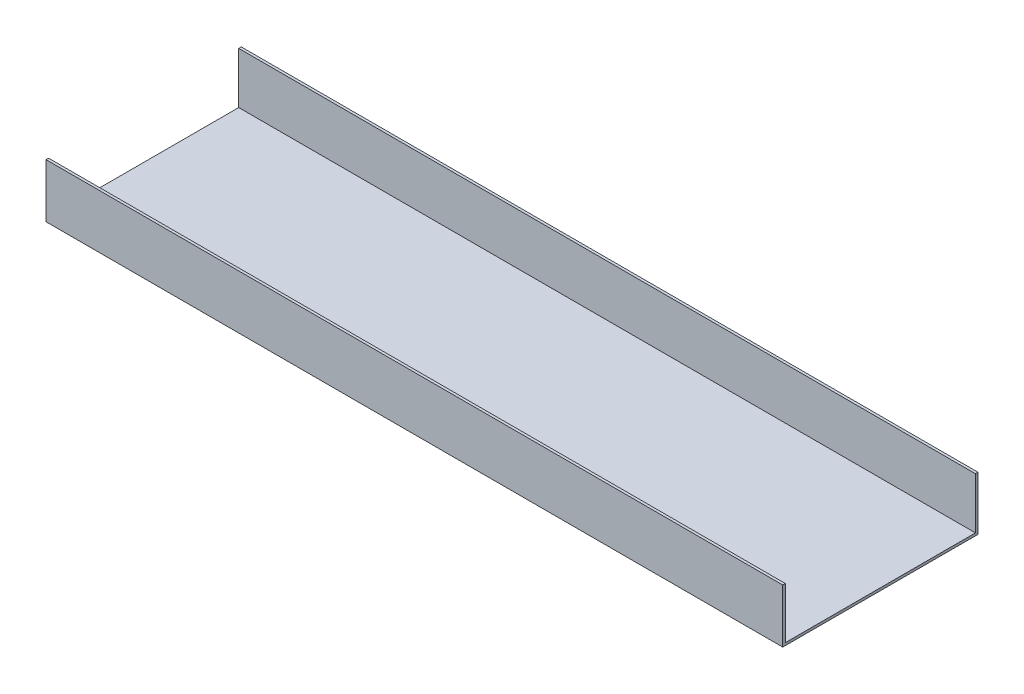
ISO-10303-21;
HEADER;
FILE_DESCRIPTION(('STEP AP214'),'2;1');
FILE_NAME('part.step','',(''),(''),'','','');
FILE_SCHEMA(('AUTOMOTIVE_DESIGN { 1 0 10303 214 1 1 1 1 }'));
ENDSEC;
DATA;
#1=APPLICATION_CONTEXT('core data for automotive mechanical design processes');
#2=APPLICATION_PROTOCOL_DEFINITION('international standard','automotive_design',2000,#1);
#3=PRODUCT_CONTEXT('',#1,'mechanical');
#4=PRODUCT('Part','Part','',(#3));
#5=PRODUCT_RELATED_PRODUCT_CATEGORY('part','',(#4));
#6=PRODUCT_DEFINITION_FORMATION('','',#4);
#7=PRODUCT_DEFINITION_CONTEXT('part definition',#1,'design');
#8=PRODUCT_DEFINITION('design','',#6,#7);
#9=PRODUCT_DEFINITION_SHAPE('','',#8);
#10=(LENGTH_UNIT() NAMED_UNIT(*) SI_UNIT(.MILLI.,.METRE.));
#11=(NAMED_UNIT(*) PLANE_ANGLE_UNIT() SI_UNIT($,.RADIAN.));
#12=(NAMED_UNIT(*) SI_UNIT($,.STERADIAN.) SOLID_ANGLE_UNIT());
#13=UNCERTAINTY_MEASURE_WITH_UNIT(LENGTH_MEASURE(1.E-05),#10,'distance_accuracy_value','');
#14=(GEOMETRIC_REPRESENTATION_CONTEXT(3) GLOBAL_UNCERTAINTY_ASSIGNED_CONTEXT((#13)) GLOBAL_UNIT_ASSIGNED_CONTEXT((#10,
#11,#12)) REPRESENTATION_CONTEXT('',''));
#15=CARTESIAN_POINT('',(0.,0.,0.));
#16=DIRECTION('',(0.,0.,1.));
#17=DIRECTION('',(1.,0.,0.));
#18=AXIS2_PLACEMENT_3D('',#15,#16,#17);
#19=CARTESIAN_POINT('',(0.,1.,0.));
#20=DIRECTION('',(0.,1.,0.));
#21=DIRECTION('',(0.,0.,1.));
#22=AXIS2_PLACEMENT_3D('',#19,#20,#21);
#23=PLANE('',#22);
#24=DIRECTION('',(0.,0.,-1.));
#25=VECTOR('',#24,1.);
#26=CARTESIAN_POINT('',(143.75,1.,-38.1));
#27=LINE('',#26,#25);
#28=CARTESIAN_POINT('',(143.75,1.,37.1));
#29=VERTEX_POINT('',#28);
#30=CARTESIAN_POINT('',(143.75,1.,-37.1));
#31=VERTEX_POINT('',#30);
#32=EDGE_CURVE('E59',#29,#31,#27,.T.);
#33=ORIENTED_EDGE('',*,*,#32,.T.);
#34=DIRECTION('',(1.,0.,0.));
#35=VECTOR('',#34,1.);
#36=CARTESIAN_POINT('',(-143.75,1.,-37.1));
#37=LINE('',#36,#35);
#38=CARTESIAN_POINT('',(-143.75,1.,-37.1));
#39=VERTEX_POINT('',#38);
#40=EDGE_CURVE('E124',#39,#31,#37,.T.);
#41=ORIENTED_EDGE('',*,*,#40,.F.);
#42=DIRECTION('',(0.,0.,1.));
#43=VECTOR('',#42,1.);
#44=CARTESIAN_POINT('',(-143.75,1.,-38.1));
#45=LINE('',#44,#43);
#46=CARTESIAN_POINT('',(-143.75,1.,37.1));
#47=VERTEX_POINT('',#46);
#48=EDGE_CURVE('E173',#39,#47,#45,.T.);
#49=ORIENTED_EDGE('',*,*,#48,.T.);
#50=DIRECTION('',(1.,0.,0.));
#51=VECTOR('',#50,1.);
#52=CARTESIAN_POINT('',(-143.75,1.,37.1));
#53=LINE('',#52,#51);
#54=EDGE_CURVE('E131',#47,#29,#53,.T.);
#55=ORIENTED_EDGE('',*,*,#54,.T.);
#56=EDGE_LOOP('',(#33,#41,#49,#55));
#57=FACE_BOUND('',#56,.T.);
#58=ADVANCED_FACE('F43',(#57),#23,.T.);
#59=CARTESIAN_POINT('',(143.75,1.,-38.1));
#60=DIRECTION('',(-1.,0.,0.));
#61=DIRECTION('',(0.,0.,1.));
#62=AXIS2_PLACEMENT_3D('',#59,#60,#61);
#63=PLANE('',#62);
#64=DIRECTION('',(0.,0.,-1.));
#65=VECTOR('',#64,1.);
#66=CARTESIAN_POINT('',(143.75,0.,-38.1));
#67=LINE('',#66,#65);
#68=CARTESIAN_POINT('',(143.75,0.,38.1));
#69=VERTEX_POINT('',#68);
#70=CARTESIAN_POINT('',(143.75,0.,-38.1));
#71=VERTEX_POINT('',#70);
#72=EDGE_CURVE('E170',#69,#71,#67,.T.);
#73=ORIENTED_EDGE('',*,*,#72,.T.);
#74=DIRECTION('',(0.,-1.,0.));
#75=VECTOR('',#74,1.);
#76=CARTESIAN_POINT('',(143.75,1.,-38.1));
#77=LINE('',#76,#75);
#78=CARTESIAN_POINT('',(143.75,21.,-38.1));
#79=VERTEX_POINT('',#78);
#80=EDGE_CURVE('E11',#79,#71,#77,.T.);
#81=ORIENTED_EDGE('',*,*,#80,.F.);
#82=DIRECTION('',(0.,0.,1.));
#83=VECTOR('',#82,1.);
#84=CARTESIAN_POINT('',(143.75,21.,-38.1));
#85=LINE('',#84,#83);
#86=CARTESIAN_POINT('',(143.75,21.,-37.1));
#87=VERTEX_POINT('',#86);
#88=EDGE_CURVE('E117',#79,#87,#85,.T.);
#89=ORIENTED_EDGE('',*,*,#88,.T.);
#90=DIRECTION('',(0.,-1.,0.));
#91=VECTOR('',#90,1.);
#92=CARTESIAN_POINT('',(143.75,21.,-37.1));
#93=LINE('',#92,#91);
#94=EDGE_CURVE('E127',#87,#31,#93,.T.);
#95=ORIENTED_EDGE('',*,*,#94,.T.);
#96=ORIENTED_EDGE('',*,*,#32,.F.);
#97=DIRECTION('',(0.,-1.,0.));
#98=VECTOR('',#97,1.);
#99=CARTESIAN_POINT('',(143.75,21.,37.1));
#100=LINE('',#99,#98);
#101=CARTESIAN_POINT('',(143.75,21.,37.1));
#102=VERTEX_POINT('',#101);
#103=EDGE_CURVE('E67',#102,#29,#100,.T.);
#104=ORIENTED_EDGE('',*,*,#103,.F.);
#105=DIRECTION('',(0.,0.,1.));
#106=VECTOR('',#105,1.);
#107=CARTESIAN_POINT('',(143.75,21.,37.1));
#108=LINE('',#107,#106);
#109=CARTESIAN_POINT('',(143.75,21.,38.1));
#110=VERTEX_POINT('',#109);
#111=EDGE_CURVE('E151',#102,#110,#108,.T.);
#112=ORIENTED_EDGE('',*,*,#111,.T.);
#113=DIRECTION('',(0.,-1.,0.));
#114=VECTOR('',#113,1.);
#115=CARTESIAN_POINT('',(143.75,1.,38.1));
#116=LINE('',#115,#114);
#117=EDGE_CURVE('E177',#110,#69,#116,.T.);
#118=ORIENTED_EDGE('',*,*,#117,.T.);
#119=EDGE_LOOP('',(#73,#81,#89,#95,#96,#104,#112,#118));
#120=FACE_BOUND('',#119,.T.);
#121=ADVANCED_FACE('F45',(#120),#63,.F.);
#122=CARTESIAN_POINT('',(-143.75,1.,-38.1));
#123=DIRECTION('',(0.,0.,1.));
#124=DIRECTION('',(1.,0.,0.));
#125=AXIS2_PLACEMENT_3D('',#122,#123,#124);
#126=PLANE('',#125);
#127=DIRECTION('',(-1.,0.,0.));
#128=VECTOR('',#127,1.);
#129=CARTESIAN_POINT('',(-143.75,0.,-38.1));
#130=LINE('',#129,#128);
#131=CARTESIAN_POINT('',(-143.75,0.,-38.1));
#132=VERTEX_POINT('',#131);
#133=EDGE_CURVE('E180',#71,#132,#130,.T.);
#134=ORIENTED_EDGE('',*,*,#133,.T.);
#135=DIRECTION('',(0.,-1.,0.));
#136=VECTOR('',#135,1.);
#137=CARTESIAN_POINT('',(-143.75,1.,-38.1));
#138=LINE('',#137,#136);
#139=CARTESIAN_POINT('',(-143.75,21.,-38.1));
#140=VERTEX_POINT('',#139);
#141=EDGE_CURVE('E52',#140,#132,#138,.T.);
#142=ORIENTED_EDGE('',*,*,#141,.F.);
#143=DIRECTION('',(1.,0.,0.));
#144=VECTOR('',#143,1.);
#145=CARTESIAN_POINT('',(-143.75,21.,-38.1));
#146=LINE('',#145,#144);
#147=EDGE_CURVE('E136',#140,#79,#146,.T.);
#148=ORIENTED_EDGE('',*,*,#147,.T.);
#149=ORIENTED_EDGE('',*,*,#80,.T.);
#150=EDGE_LOOP('',(#134,#142,#148,#149));
#151=FACE_BOUND('',#150,.T.);
#152=ADVANCED_FACE('F218',(#151),#126,.F.);
#153=CARTESIAN_POINT('',(-143.75,1.,-38.1));
#154=DIRECTION('',(1.,0.,0.));
#155=DIRECTION('',(0.,0.,-1.));
#156=AXIS2_PLACEMENT_3D('',#153,#154,#155);
#157=PLANE('',#156);
#158=DIRECTION('',(0.,0.,1.));
#159=VECTOR('',#158,1.);
#160=CARTESIAN_POINT('',(-143.75,0.,-38.1));
#161=LINE('',#160,#159);
#162=CARTESIAN_POINT('',(-143.75,0.,38.1));
#163=VERTEX_POINT('',#162);
#164=EDGE_CURVE('E183',#132,#163,#161,.T.);
#165=ORIENTED_EDGE('',*,*,#164,.T.);
#166=DIRECTION('',(0.,-1.,0.));
#167=VECTOR('',#166,1.);
#168=CARTESIAN_POINT('',(-143.75,1.,38.1));
#169=LINE('',#168,#167);
#170=CARTESIAN_POINT('',(-143.75,21.,38.1));
#171=VERTEX_POINT('',#170);
#172=EDGE_CURVE('E191',#171,#163,#169,.T.);
#173=ORIENTED_EDGE('',*,*,#172,.F.);
#174=DIRECTION('',(0.,0.,-1.));
#175=VECTOR('',#174,1.);
#176=CARTESIAN_POINT('',(-143.75,21.,38.1));
#177=LINE('',#176,#175);
#178=CARTESIAN_POINT('',(-143.75,21.,37.1));
#179=VERTEX_POINT('',#178);
#180=EDGE_CURVE('E158',#171,#179,#177,.T.);
#181=ORIENTED_EDGE('',*,*,#180,.T.);
#182=DIRECTION('',(0.,-1.,0.));
#183=VECTOR('',#182,1.);
#184=CARTESIAN_POINT('',(-143.75,21.,37.1));
#185=LINE('',#184,#183);
#186=EDGE_CURVE('E162',#179,#47,#185,.T.);
#187=ORIENTED_EDGE('',*,*,#186,.T.);
#188=ORIENTED_EDGE('',*,*,#48,.F.);
#189=DIRECTION('',(0.,-1.,0.));
#190=VECTOR('',#189,1.);
#191=CARTESIAN_POINT('',(-143.75,21.,-37.1));
#192=LINE('',#191,#190);
#193=CARTESIAN_POINT('',(-143.75,21.,-37.1));
#194=VERTEX_POINT('',#193);
#195=EDGE_CURVE('E132',#194,#39,#192,.T.);
#196=ORIENTED_EDGE('',*,*,#195,.F.);
#197=DIRECTION('',(0.,0.,-1.));
#198=VECTOR('',#197,1.);
#199=CARTESIAN_POINT('',(-143.75,21.,-37.1));
#200=LINE('',#199,#198);
#201=EDGE_CURVE('E120',#194,#140,#200,.T.);
#202=ORIENTED_EDGE('',*,*,#201,.T.);
#203=ORIENTED_EDGE('',*,*,#141,.T.);
#204=EDGE_LOOP('',(#165,#173,#181,#187,#188,#196,#202,#203));
#205=FACE_BOUND('',#204,.T.);
#206=ADVANCED_FACE('F198',(#205),#157,.F.);
#207=CARTESIAN_POINT('',(-143.75,1.,38.1));
#208=DIRECTION('',(0.,0.,-1.));
#209=DIRECTION('',(-1.,0.,0.));
#210=AXIS2_PLACEMENT_3D('',#207,#208,#209);
#211=PLANE('',#210);
#212=DIRECTION('',(1.,0.,0.));
#213=VECTOR('',#212,1.);
#214=CARTESIAN_POINT('',(-143.75,0.,38.1));
#215=LINE('',#214,#213);
#216=EDGE_CURVE('E174',#163,#69,#215,.T.);
#217=ORIENTED_EDGE('',*,*,#216,.T.);
#218=ORIENTED_EDGE('',*,*,#117,.F.);
#219=DIRECTION('',(1.,0.,0.));
#220=VECTOR('',#219,1.);
#221=CARTESIAN_POINT('',(-143.75,21.,38.1));
#222=LINE('',#221,#220);
#223=EDGE_CURVE('E147',#171,#110,#222,.T.);
#224=ORIENTED_EDGE('',*,*,#223,.F.);
#225=ORIENTED_EDGE('',*,*,#172,.T.);
#226=EDGE_LOOP('',(#217,#218,#224,#225));
#227=FACE_BOUND('',#226,.T.);
#228=ADVANCED_FACE('F205',(#227),#211,.F.);
#229=CARTESIAN_POINT('',(0.,0.,0.));
#230=DIRECTION('',(0.,1.,0.));
#231=DIRECTION('',(0.,0.,1.));
#232=AXIS2_PLACEMENT_3D('',#229,#230,#231);
#233=PLANE('',#232);
#234=ORIENTED_EDGE('',*,*,#72,.F.);
#235=ORIENTED_EDGE('',*,*,#216,.F.);
#236=ORIENTED_EDGE('',*,*,#164,.F.);
#237=ORIENTED_EDGE('',*,*,#133,.F.);
#238=EDGE_LOOP('',(#234,#235,#236,#237));
#239=FACE_BOUND('',#238,.T.);
#240=ADVANCED_FACE('F203',(#239),#233,.F.);
#241=CARTESIAN_POINT('',(-143.75,21.,37.1));
#242=DIRECTION('',(0.,0.,-1.));
#243=DIRECTION('',(-1.,0.,0.));
#244=AXIS2_PLACEMENT_3D('',#241,#242,#243);
#245=PLANE('',#244);
#246=ORIENTED_EDGE('',*,*,#54,.F.);
#247=ORIENTED_EDGE('',*,*,#186,.F.);
#248=DIRECTION('',(1.,0.,0.));
#249=VECTOR('',#248,1.);
#250=CARTESIAN_POINT('',(-143.75,21.,37.1));
#251=LINE('',#250,#249);
#252=EDGE_CURVE('E155',#179,#102,#251,.T.);
#253=ORIENTED_EDGE('',*,*,#252,.T.);
#254=ORIENTED_EDGE('',*,*,#103,.T.);
#255=EDGE_LOOP('',(#246,#247,#253,#254));
#256=FACE_BOUND('',#255,.T.);
#257=ADVANCED_FACE('F212',(#256),#245,.T.);
#258=CARTESIAN_POINT('',(0.,21.,0.));
#259=DIRECTION('',(0.,-1.,0.));
#260=DIRECTION('',(-1.,0.,0.));
#261=AXIS2_PLACEMENT_3D('',#258,#259,#260);
#262=PLANE('',#261);
#263=ORIENTED_EDGE('',*,*,#223,.T.);
#264=ORIENTED_EDGE('',*,*,#111,.F.);
#265=ORIENTED_EDGE('',*,*,#252,.F.);
#266=ORIENTED_EDGE('',*,*,#180,.F.);
#267=EDGE_LOOP('',(#263,#264,#265,#266));
#268=FACE_BOUND('',#267,.T.);
#269=ADVANCED_FACE('F210',(#268),#262,.F.);
#270=CARTESIAN_POINT('',(-143.75,21.,-37.1));
#271=DIRECTION('',(0.,0.,-1.));
#272=DIRECTION('',(-1.,0.,0.));
#273=AXIS2_PLACEMENT_3D('',#270,#271,#272);
#274=PLANE('',#273);
#275=ORIENTED_EDGE('',*,*,#40,.T.);
#276=ORIENTED_EDGE('',*,*,#94,.F.);
#277=DIRECTION('',(1.,0.,0.));
#278=VECTOR('',#277,1.);
#279=CARTESIAN_POINT('',(-143.75,21.,-37.1));
#280=LINE('',#279,#278);
#281=EDGE_CURVE('E112',#194,#87,#280,.T.);
#282=ORIENTED_EDGE('',*,*,#281,.F.);
#283=ORIENTED_EDGE('',*,*,#195,.T.);
#284=EDGE_LOOP('',(#275,#276,#282,#283));
#285=FACE_BOUND('',#284,.T.);
#286=ADVANCED_FACE('F128',(#285),#274,.F.);
#287=CARTESIAN_POINT('',(0.,21.,0.));
#288=DIRECTION('',(0.,-1.,0.));
#289=DIRECTION('',(-1.,0.,0.));
#290=AXIS2_PLACEMENT_3D('',#287,#288,#289);
#291=PLANE('',#290);
#292=ORIENTED_EDGE('',*,*,#281,.T.);
#293=ORIENTED_EDGE('',*,*,#88,.F.);
#294=ORIENTED_EDGE('',*,*,#147,.F.);
#295=ORIENTED_EDGE('',*,*,#201,.F.);
#296=EDGE_LOOP('',(#292,#293,#294,#295));
#297=FACE_BOUND('',#296,.T.);
#298=ADVANCED_FACE('F114',(#297),#291,.F.);
#299=CLOSED_SHELL('',(#58,#121,#152,#206,#228,#240,#257,#269,#286,#298));
#300=MANIFOLD_SOLID_BREP('B2',#299);
#301=ADVANCED_BREP_SHAPE_REPRESENTATION('',(#18,#300),#14);
#302=SHAPE_DEFINITION_REPRESENTATION(#9,#301);
ENDSEC;
END-ISO-10303-21;
